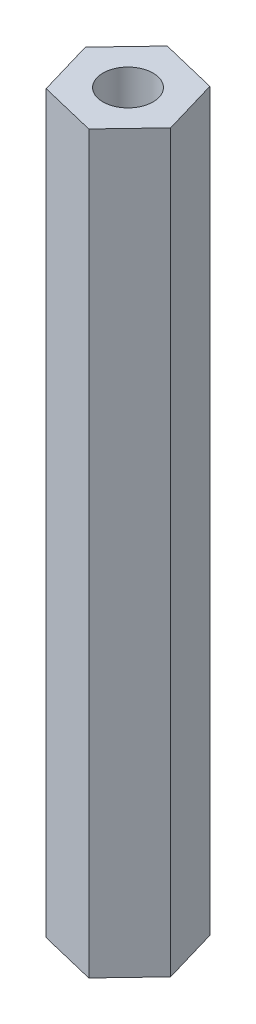
ISO-10303-21;
HEADER;
FILE_DESCRIPTION(('STEP AP214'),'2;1');
FILE_NAME('part.step','',(''),(''),'','','');
FILE_SCHEMA(('AUTOMOTIVE_DESIGN { 1 0 10303 214 1 1 1 1 }'));
ENDSEC;
DATA;
#1=APPLICATION_CONTEXT('core data for automotive mechanical design processes');
#2=APPLICATION_PROTOCOL_DEFINITION('international standard','automotive_design',2000,#1);
#3=PRODUCT_CONTEXT('',#1,'mechanical');
#4=PRODUCT('Part','Part','',(#3));
#5=PRODUCT_RELATED_PRODUCT_CATEGORY('part','',(#4));
#6=PRODUCT_DEFINITION_FORMATION('','',#4);
#7=PRODUCT_DEFINITION_CONTEXT('part definition',#1,'design');
#8=PRODUCT_DEFINITION('design','',#6,#7);
#9=PRODUCT_DEFINITION_SHAPE('','',#8);
#10=(LENGTH_UNIT() NAMED_UNIT(*) SI_UNIT(.MILLI.,.METRE.));
#11=(NAMED_UNIT(*) PLANE_ANGLE_UNIT() SI_UNIT($,.RADIAN.));
#12=(NAMED_UNIT(*) SI_UNIT($,.STERADIAN.) SOLID_ANGLE_UNIT());
#13=UNCERTAINTY_MEASURE_WITH_UNIT(LENGTH_MEASURE(1.E-05),#10,'distance_accuracy_value','');
#14=(GEOMETRIC_REPRESENTATION_CONTEXT(3) GLOBAL_UNCERTAINTY_ASSIGNED_CONTEXT((#13)) GLOBAL_UNIT_ASSIGNED_CONTEXT((#10,
#11,#12)) REPRESENTATION_CONTEXT('',''));
#15=CARTESIAN_POINT('',(0.,0.,0.));
#16=DIRECTION('',(0.,0.,1.));
#17=DIRECTION('',(1.,0.,0.));
#18=AXIS2_PLACEMENT_3D('',#15,#16,#17);
#19=CARTESIAN_POINT('',(0.,22.,0.));
#20=DIRECTION('',(0.,1.,0.));
#21=DIRECTION('',(0.,0.,1.));
#22=AXIS2_PLACEMENT_3D('',#19,#20,#21);
#23=PLANE('',#22);
#24=DIRECTION('',(0.971906320154711,0.,0.235368020009788));
#25=VECTOR('',#24,1.);
#26=CARTESIAN_POINT('',(-2.38949518673463,22.,2.50804959133029));
#27=LINE('',#26,#25);
#28=CARTESIAN_POINT('',(-2.38949518673463,22.,2.50804959133029));
#29=VERTEX_POINT('',#28);
#30=CARTESIAN_POINT('',(0.9772870666759,22.,3.32338832959798));
#31=VERTEX_POINT('',#30);
#32=EDGE_CURVE('E132',#29,#31,#27,.T.);
#33=ORIENTED_EDGE('',*,*,#32,.T.);
#34=DIRECTION('',(0.689787844644276,0.,-0.724011553347738));
#35=VECTOR('',#34,1.);
#36=CARTESIAN_POINT('',(0.9772870666759,22.,3.32338832959798));
#37=LINE('',#36,#35);
#38=CARTESIAN_POINT('',(3.36678225341053,22.,0.815338738267681));
#39=VERTEX_POINT('',#38);
#40=EDGE_CURVE('E90',#31,#39,#37,.T.);
#41=ORIENTED_EDGE('',*,*,#40,.T.);
#42=DIRECTION('',(-0.282118475510435,0.,-0.959379573357526));
#43=VECTOR('',#42,1.);
#44=CARTESIAN_POINT('',(3.36678225341053,22.,0.815338738267681));
#45=LINE('',#44,#43);
#46=CARTESIAN_POINT('',(2.38949518673463,22.,-2.50804959133029));
#47=VERTEX_POINT('',#46);
#48=EDGE_CURVE('E103',#39,#47,#45,.T.);
#49=ORIENTED_EDGE('',*,*,#48,.T.);
#50=DIRECTION('',(-0.971906320154711,0.,-0.235368020009788));
#51=VECTOR('',#50,1.);
#52=CARTESIAN_POINT('',(2.38949518673463,22.,-2.50804959133029));
#53=LINE('',#52,#51);
#54=CARTESIAN_POINT('',(-0.977287066675899,22.,-3.32338832959798));
#55=VERTEX_POINT('',#54);
#56=EDGE_CURVE('E97',#47,#55,#53,.T.);
#57=ORIENTED_EDGE('',*,*,#56,.T.);
#58=DIRECTION('',(-0.689787844644276,0.,0.724011553347738));
#59=VECTOR('',#58,1.);
#60=CARTESIAN_POINT('',(-0.977287066675899,22.,-3.32338832959798));
#61=LINE('',#60,#59);
#62=CARTESIAN_POINT('',(-3.36678225341053,22.,-0.815338738267681));
#63=VERTEX_POINT('',#62);
#64=EDGE_CURVE('E101',#55,#63,#61,.T.);
#65=ORIENTED_EDGE('',*,*,#64,.T.);
#66=DIRECTION('',(0.282118475510435,0.,0.959379573357526));
#67=VECTOR('',#66,1.);
#68=CARTESIAN_POINT('',(-3.36678225341053,22.,-0.815338738267681));
#69=LINE('',#68,#67);
#70=EDGE_CURVE('E53',#63,#29,#69,.T.);
#71=ORIENTED_EDGE('',*,*,#70,.T.);
#72=EDGE_LOOP('',(#33,#41,#49,#57,#65,#71));
#73=FACE_BOUND('',#72,.T.);
#74=CARTESIAN_POINT('',(0.,22.,0.));
#75=DIRECTION('',(0.,1.,0.));
#76=DIRECTION('',(0.,0.,1.));
#77=AXIS2_PLACEMENT_3D('',#74,#75,#76);
#78=CIRCLE('',#77,1.5);
#79=CARTESIAN_POINT('',(0.,22.,1.5));
#80=VERTEX_POINT('',#79);
#81=EDGE_CURVE('E125',#80,#80,#78,.T.);
#82=ORIENTED_EDGE('',*,*,#81,.F.);
#83=EDGE_LOOP('',(#82));
#84=FACE_BOUND('',#83,.T.);
#85=ADVANCED_FACE('F36',(#73,#84),#23,.T.);
#86=CARTESIAN_POINT('',(0.,-22.,0.));
#87=DIRECTION('',(0.,1.,0.));
#88=DIRECTION('',(0.,0.,1.));
#89=AXIS2_PLACEMENT_3D('',#86,#87,#88);
#90=PLANE('',#89);
#91=DIRECTION('',(0.971906320154711,0.,0.235368020009788));
#92=VECTOR('',#91,1.);
#93=CARTESIAN_POINT('',(-2.38949518673463,-22.,2.50804959133029));
#94=LINE('',#93,#92);
#95=CARTESIAN_POINT('',(-2.38949518673463,-22.,2.50804959133029));
#96=VERTEX_POINT('',#95);
#97=CARTESIAN_POINT('',(0.9772870666759,-22.,3.32338832959798));
#98=VERTEX_POINT('',#97);
#99=EDGE_CURVE('E121',#96,#98,#94,.T.);
#100=ORIENTED_EDGE('',*,*,#99,.F.);
#101=DIRECTION('',(0.282118475510435,0.,0.959379573357526));
#102=VECTOR('',#101,1.);
#103=CARTESIAN_POINT('',(-3.36678225341053,-22.,-0.815338738267681));
#104=LINE('',#103,#102);
#105=CARTESIAN_POINT('',(-3.36678225341053,-22.,-0.815338738267681));
#106=VERTEX_POINT('',#105);
#107=EDGE_CURVE('E82',#106,#96,#104,.T.);
#108=ORIENTED_EDGE('',*,*,#107,.F.);
#109=DIRECTION('',(-0.689787844644276,0.,0.724011553347738));
#110=VECTOR('',#109,1.);
#111=CARTESIAN_POINT('',(-0.977287066675899,-22.,-3.32338832959798));
#112=LINE('',#111,#110);
#113=CARTESIAN_POINT('',(-0.977287066675899,-22.,-3.32338832959798));
#114=VERTEX_POINT('',#113);
#115=EDGE_CURVE('E76',#114,#106,#112,.T.);
#116=ORIENTED_EDGE('',*,*,#115,.F.);
#117=DIRECTION('',(-0.971906320154711,0.,-0.235368020009788));
#118=VECTOR('',#117,1.);
#119=CARTESIAN_POINT('',(2.38949518673463,-22.,-2.50804959133029));
#120=LINE('',#119,#118);
#121=CARTESIAN_POINT('',(2.38949518673463,-22.,-2.50804959133029));
#122=VERTEX_POINT('',#121);
#123=EDGE_CURVE('E111',#122,#114,#120,.T.);
#124=ORIENTED_EDGE('',*,*,#123,.F.);
#125=DIRECTION('',(-0.282118475510435,0.,-0.959379573357526));
#126=VECTOR('',#125,1.);
#127=CARTESIAN_POINT('',(3.36678225341053,-22.,0.815338738267681));
#128=LINE('',#127,#126);
#129=CARTESIAN_POINT('',(3.36678225341053,-22.,0.815338738267681));
#130=VERTEX_POINT('',#129);
#131=EDGE_CURVE('E127',#130,#122,#128,.T.);
#132=ORIENTED_EDGE('',*,*,#131,.F.);
#133=DIRECTION('',(0.689787844644276,0.,-0.724011553347738));
#134=VECTOR('',#133,1.);
#135=CARTESIAN_POINT('',(0.9772870666759,-22.,3.32338832959798));
#136=LINE('',#135,#134);
#137=EDGE_CURVE('E124',#98,#130,#136,.T.);
#138=ORIENTED_EDGE('',*,*,#137,.F.);
#139=EDGE_LOOP('',(#100,#108,#116,#124,#132,#138));
#140=FACE_BOUND('',#139,.T.);
#141=CARTESIAN_POINT('',(0.,-22.,0.));
#142=DIRECTION('',(0.,1.,0.));
#143=DIRECTION('',(0.,0.,1.));
#144=AXIS2_PLACEMENT_3D('',#141,#142,#143);
#145=CIRCLE('',#144,1.5);
#146=CARTESIAN_POINT('',(0.,-22.,1.5));
#147=VERTEX_POINT('',#146);
#148=EDGE_CURVE('E225',#147,#147,#145,.T.);
#149=ORIENTED_EDGE('',*,*,#148,.T.);
#150=EDGE_LOOP('',(#149));
#151=FACE_BOUND('',#150,.T.);
#152=ADVANCED_FACE('F141',(#140,#151),#90,.F.);
#153=CARTESIAN_POINT('',(-2.38949518673463,22.,2.50804959133029));
#154=DIRECTION('',(0.235368020009788,0.,-0.971906320154711));
#155=DIRECTION('',(-0.971906320154711,0.,-0.235368020009788));
#156=AXIS2_PLACEMENT_3D('',#153,#154,#155);
#157=PLANE('',#156);
#158=ORIENTED_EDGE('',*,*,#99,.T.);
#159=DIRECTION('',(0.,-1.,0.));
#160=VECTOR('',#159,1.);
#161=CARTESIAN_POINT('',(0.9772870666759,22.,3.32338832959798));
#162=LINE('',#161,#160);
#163=EDGE_CURVE('E11',#31,#98,#162,.T.);
#164=ORIENTED_EDGE('',*,*,#163,.F.);
#165=ORIENTED_EDGE('',*,*,#32,.F.);
#166=DIRECTION('',(0.,-1.,0.));
#167=VECTOR('',#166,1.);
#168=CARTESIAN_POINT('',(-2.38949518673463,22.,2.50804959133029));
#169=LINE('',#168,#167);
#170=EDGE_CURVE('E117',#29,#96,#169,.T.);
#171=ORIENTED_EDGE('',*,*,#170,.T.);
#172=EDGE_LOOP('',(#158,#164,#165,#171));
#173=FACE_BOUND('',#172,.T.);
#174=ADVANCED_FACE('F38',(#173),#157,.F.);
#175=CARTESIAN_POINT('',(0.9772870666759,22.,3.32338832959798));
#176=DIRECTION('',(-0.724011553347738,0.,-0.689787844644276));
#177=DIRECTION('',(-0.689787844644276,0.,0.724011553347738));
#178=AXIS2_PLACEMENT_3D('',#175,#176,#177);
#179=PLANE('',#178);
#180=ORIENTED_EDGE('',*,*,#137,.T.);
#181=DIRECTION('',(0.,-1.,0.));
#182=VECTOR('',#181,1.);
#183=CARTESIAN_POINT('',(3.36678225341053,22.,0.815338738267681));
#184=LINE('',#183,#182);
#185=EDGE_CURVE('E45',#39,#130,#184,.T.);
#186=ORIENTED_EDGE('',*,*,#185,.F.);
#187=ORIENTED_EDGE('',*,*,#40,.F.);
#188=ORIENTED_EDGE('',*,*,#163,.T.);
#189=EDGE_LOOP('',(#180,#186,#187,#188));
#190=FACE_BOUND('',#189,.T.);
#191=ADVANCED_FACE('F166',(#190),#179,.F.);
#192=CARTESIAN_POINT('',(3.36678225341053,22.,0.815338738267681));
#193=DIRECTION('',(-0.959379573357526,0.,0.282118475510435));
#194=DIRECTION('',(0.282118475510435,0.,0.959379573357526));
#195=AXIS2_PLACEMENT_3D('',#192,#193,#194);
#196=PLANE('',#195);
#197=ORIENTED_EDGE('',*,*,#131,.T.);
#198=DIRECTION('',(0.,-1.,0.));
#199=VECTOR('',#198,1.);
#200=CARTESIAN_POINT('',(2.38949518673463,22.,-2.50804959133029));
#201=LINE('',#200,#199);
#202=EDGE_CURVE('E112',#47,#122,#201,.T.);
#203=ORIENTED_EDGE('',*,*,#202,.F.);
#204=ORIENTED_EDGE('',*,*,#48,.F.);
#205=ORIENTED_EDGE('',*,*,#185,.T.);
#206=EDGE_LOOP('',(#197,#203,#204,#205));
#207=FACE_BOUND('',#206,.T.);
#208=ADVANCED_FACE('F138',(#207),#196,.F.);
#209=CARTESIAN_POINT('',(2.38949518673463,22.,-2.50804959133029));
#210=DIRECTION('',(-0.235368020009788,0.,0.971906320154711));
#211=DIRECTION('',(0.971906320154711,0.,0.235368020009788));
#212=AXIS2_PLACEMENT_3D('',#209,#210,#211);
#213=PLANE('',#212);
#214=ORIENTED_EDGE('',*,*,#123,.T.);
#215=DIRECTION('',(0.,-1.,0.));
#216=VECTOR('',#215,1.);
#217=CARTESIAN_POINT('',(-0.977287066675899,22.,-3.32338832959798));
#218=LINE('',#217,#216);
#219=EDGE_CURVE('E108',#55,#114,#218,.T.);
#220=ORIENTED_EDGE('',*,*,#219,.F.);
#221=ORIENTED_EDGE('',*,*,#56,.F.);
#222=ORIENTED_EDGE('',*,*,#202,.T.);
#223=EDGE_LOOP('',(#214,#220,#221,#222));
#224=FACE_BOUND('',#223,.T.);
#225=ADVANCED_FACE('F109',(#224),#213,.F.);
#226=CARTESIAN_POINT('',(-0.977287066675899,22.,-3.32338832959798));
#227=DIRECTION('',(0.724011553347738,0.,0.689787844644276));
#228=DIRECTION('',(0.689787844644276,0.,-0.724011553347738));
#229=AXIS2_PLACEMENT_3D('',#226,#227,#228);
#230=PLANE('',#229);
#231=ORIENTED_EDGE('',*,*,#115,.T.);
#232=DIRECTION('',(0.,-1.,0.));
#233=VECTOR('',#232,1.);
#234=CARTESIAN_POINT('',(-3.36678225341053,22.,-0.815338738267681));
#235=LINE('',#234,#233);
#236=EDGE_CURVE('E113',#63,#106,#235,.T.);
#237=ORIENTED_EDGE('',*,*,#236,.F.);
#238=ORIENTED_EDGE('',*,*,#64,.F.);
#239=ORIENTED_EDGE('',*,*,#219,.T.);
#240=EDGE_LOOP('',(#231,#237,#238,#239));
#241=FACE_BOUND('',#240,.T.);
#242=ADVANCED_FACE('F115',(#241),#230,.F.);
#243=CARTESIAN_POINT('',(-3.36678225341053,22.,-0.815338738267681));
#244=DIRECTION('',(0.959379573357526,0.,-0.282118475510435));
#245=DIRECTION('',(-0.282118475510435,0.,-0.959379573357526));
#246=AXIS2_PLACEMENT_3D('',#243,#244,#245);
#247=PLANE('',#246);
#248=ORIENTED_EDGE('',*,*,#107,.T.);
#249=ORIENTED_EDGE('',*,*,#170,.F.);
#250=ORIENTED_EDGE('',*,*,#70,.F.);
#251=ORIENTED_EDGE('',*,*,#236,.T.);
#252=EDGE_LOOP('',(#248,#249,#250,#251));
#253=FACE_BOUND('',#252,.T.);
#254=ADVANCED_FACE('F146',(#253),#247,.F.);
#255=CARTESIAN_POINT('',(0.,22.,0.));
#256=DIRECTION('',(0.,-1.,0.));
#257=DIRECTION('',(0.,0.,-1.));
#258=AXIS2_PLACEMENT_3D('',#255,#256,#257);
#259=CYLINDRICAL_SURFACE('',#258,1.5);
#260=ORIENTED_EDGE('',*,*,#81,.T.);
#261=EDGE_LOOP('',(#260));
#262=FACE_BOUND('',#261,.T.);
#263=ORIENTED_EDGE('',*,*,#148,.F.);
#264=EDGE_LOOP('',(#263));
#265=FACE_BOUND('',#264,.T.);
#266=ADVANCED_FACE('F148',(#262,#265),#259,.F.);
#267=CLOSED_SHELL('',(#85,#152,#174,#191,#208,#225,#242,#254,#266));
#268=MANIFOLD_SOLID_BREP('B2',#267);
#269=ADVANCED_BREP_SHAPE_REPRESENTATION('',(#18,#268),#14);
#270=SHAPE_DEFINITION_REPRESENTATION(#9,#269);
ENDSEC;
END-ISO-10303-21;
